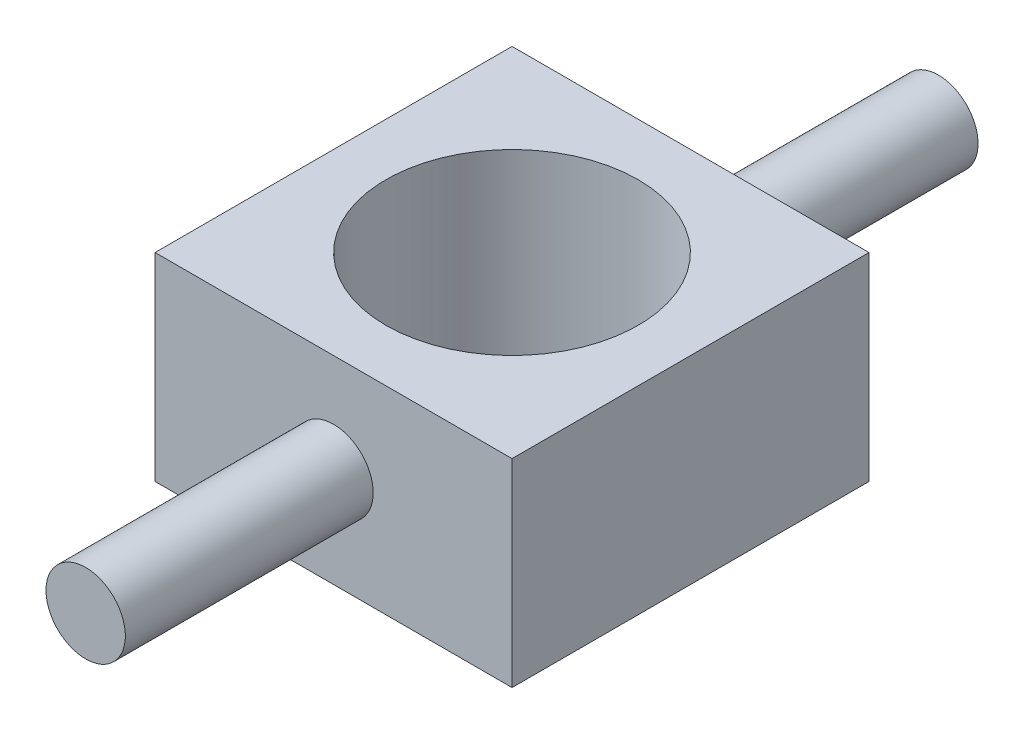
ISO-10303-21;
HEADER;
FILE_DESCRIPTION(('STEP AP214'),'2;1');
FILE_NAME('part.step','',(''),(''),'','','');
FILE_SCHEMA(('AUTOMOTIVE_DESIGN { 1 0 10303 214 1 1 1 1 }'));
ENDSEC;
DATA;
#1=APPLICATION_CONTEXT('core data for automotive mechanical design processes');
#2=APPLICATION_PROTOCOL_DEFINITION('international standard','automotive_design',2000,#1);
#3=PRODUCT_CONTEXT('',#1,'mechanical');
#4=PRODUCT('Part','Part','',(#3));
#5=PRODUCT_RELATED_PRODUCT_CATEGORY('part','',(#4));
#6=PRODUCT_DEFINITION_FORMATION('','',#4);
#7=PRODUCT_DEFINITION_CONTEXT('part definition',#1,'design');
#8=PRODUCT_DEFINITION('design','',#6,#7);
#9=PRODUCT_DEFINITION_SHAPE('','',#8);
#10=(LENGTH_UNIT() NAMED_UNIT(*) SI_UNIT(.MILLI.,.METRE.));
#11=(NAMED_UNIT(*) PLANE_ANGLE_UNIT() SI_UNIT($,.RADIAN.));
#12=(NAMED_UNIT(*) SI_UNIT($,.STERADIAN.) SOLID_ANGLE_UNIT());
#13=UNCERTAINTY_MEASURE_WITH_UNIT(LENGTH_MEASURE(1.E-05),#10,'distance_accuracy_value','');
#14=(GEOMETRIC_REPRESENTATION_CONTEXT(3) GLOBAL_UNCERTAINTY_ASSIGNED_CONTEXT((#13)) GLOBAL_UNIT_ASSIGNED_CONTEXT((#10,
#11,#12)) REPRESENTATION_CONTEXT('',''));
#15=CARTESIAN_POINT('',(0.,0.,0.));
#16=DIRECTION('',(0.,0.,1.));
#17=DIRECTION('',(1.,0.,0.));
#18=AXIS2_PLACEMENT_3D('',#15,#16,#17);
#19=CARTESIAN_POINT('',(18.,-10.,-18.));
#20=DIRECTION('',(1.,0.,0.));
#21=DIRECTION('',(0.,0.,-1.));
#22=AXIS2_PLACEMENT_3D('',#19,#20,#21);
#23=PLANE('',#22);
#24=DIRECTION('',(0.,1.,0.));
#25=VECTOR('',#24,1.);
#26=CARTESIAN_POINT('',(18.,-10.,-18.));
#27=LINE('',#26,#25);
#28=CARTESIAN_POINT('',(18.,-10.,-18.));
#29=VERTEX_POINT('',#28);
#30=CARTESIAN_POINT('',(18.,10.,-18.));
#31=VERTEX_POINT('',#30);
#32=EDGE_CURVE('E48',#29,#31,#27,.T.);
#33=ORIENTED_EDGE('',*,*,#32,.T.);
#34=DIRECTION('',(0.,0.,-1.));
#35=VECTOR('',#34,1.);
#36=CARTESIAN_POINT('',(18.,10.,-18.));
#37=LINE('',#36,#35);
#38=CARTESIAN_POINT('',(18.,10.,18.));
#39=VERTEX_POINT('',#38);
#40=EDGE_CURVE('E88',#39,#31,#37,.T.);
#41=ORIENTED_EDGE('',*,*,#40,.F.);
#42=DIRECTION('',(0.,1.,0.));
#43=VECTOR('',#42,1.);
#44=CARTESIAN_POINT('',(18.,-10.,18.));
#45=LINE('',#44,#43);
#46=CARTESIAN_POINT('',(18.,-10.,18.));
#47=VERTEX_POINT('',#46);
#48=EDGE_CURVE('E54',#47,#39,#45,.T.);
#49=ORIENTED_EDGE('',*,*,#48,.F.);
#50=DIRECTION('',(0.,0.,-1.));
#51=VECTOR('',#50,1.);
#52=CARTESIAN_POINT('',(18.,-10.,-18.));
#53=LINE('',#52,#51);
#54=EDGE_CURVE('E89',#47,#29,#53,.T.);
#55=ORIENTED_EDGE('',*,*,#54,.T.);
#56=EDGE_LOOP('',(#33,#41,#49,#55));
#57=FACE_BOUND('',#56,.T.);
#58=ADVANCED_FACE('F45',(#57),#23,.T.);
#59=CARTESIAN_POINT('',(-18.,-10.,18.));
#60=DIRECTION('',(0.,0.,1.));
#61=DIRECTION('',(1.,0.,0.));
#62=AXIS2_PLACEMENT_3D('',#59,#60,#61);
#63=PLANE('',#62);
#64=CARTESIAN_POINT('',(0.,0.,18.));
#65=DIRECTION('',(0.,0.,-1.));
#66=DIRECTION('',(-1.,0.,0.));
#67=AXIS2_PLACEMENT_3D('',#64,#65,#66);
#68=CIRCLE('',#67,4.);
#69=CARTESIAN_POINT('',(-4.,0.,18.));
#70=VERTEX_POINT('',#69);
#71=EDGE_CURVE('E166',#70,#70,#68,.T.);
#72=ORIENTED_EDGE('',*,*,#71,.T.);
#73=EDGE_LOOP('',(#72));
#74=FACE_BOUND('',#73,.T.);
#75=ORIENTED_EDGE('',*,*,#48,.T.);
#76=DIRECTION('',(1.,0.,0.));
#77=VECTOR('',#76,1.);
#78=CARTESIAN_POINT('',(-18.,10.,18.));
#79=LINE('',#78,#77);
#80=CARTESIAN_POINT('',(-18.,10.,18.));
#81=VERTEX_POINT('',#80);
#82=EDGE_CURVE('E107',#81,#39,#79,.T.);
#83=ORIENTED_EDGE('',*,*,#82,.F.);
#84=DIRECTION('',(0.,1.,0.));
#85=VECTOR('',#84,1.);
#86=CARTESIAN_POINT('',(-18.,-10.,18.));
#87=LINE('',#86,#85);
#88=CARTESIAN_POINT('',(-18.,-10.,18.));
#89=VERTEX_POINT('',#88);
#90=EDGE_CURVE('E69',#89,#81,#87,.T.);
#91=ORIENTED_EDGE('',*,*,#90,.F.);
#92=DIRECTION('',(1.,0.,0.));
#93=VECTOR('',#92,1.);
#94=CARTESIAN_POINT('',(-18.,-10.,18.));
#95=LINE('',#94,#93);
#96=EDGE_CURVE('E95',#89,#47,#95,.T.);
#97=ORIENTED_EDGE('',*,*,#96,.T.);
#98=EDGE_LOOP('',(#75,#83,#91,#97));
#99=FACE_BOUND('',#98,.T.);
#100=ADVANCED_FACE('F139',(#74,#99),#63,.T.);
#101=CARTESIAN_POINT('',(-18.,-10.,-18.));
#102=DIRECTION('',(-1.,0.,0.));
#103=DIRECTION('',(0.,0.,1.));
#104=AXIS2_PLACEMENT_3D('',#101,#102,#103);
#105=PLANE('',#104);
#106=ORIENTED_EDGE('',*,*,#90,.T.);
#107=DIRECTION('',(0.,0.,1.));
#108=VECTOR('',#107,1.);
#109=CARTESIAN_POINT('',(-18.,10.,-18.));
#110=LINE('',#109,#108);
#111=CARTESIAN_POINT('',(-18.,10.,-18.));
#112=VERTEX_POINT('',#111);
#113=EDGE_CURVE('E103',#112,#81,#110,.T.);
#114=ORIENTED_EDGE('',*,*,#113,.F.);
#115=DIRECTION('',(0.,1.,0.));
#116=VECTOR('',#115,1.);
#117=CARTESIAN_POINT('',(-18.,-10.,-18.));
#118=LINE('',#117,#116);
#119=CARTESIAN_POINT('',(-18.,-10.,-18.));
#120=VERTEX_POINT('',#119);
#121=EDGE_CURVE('E94',#120,#112,#118,.T.);
#122=ORIENTED_EDGE('',*,*,#121,.F.);
#123=DIRECTION('',(0.,0.,1.));
#124=VECTOR('',#123,1.);
#125=CARTESIAN_POINT('',(-18.,-10.,-18.));
#126=LINE('',#125,#124);
#127=EDGE_CURVE('E126',#120,#89,#126,.T.);
#128=ORIENTED_EDGE('',*,*,#127,.T.);
#129=EDGE_LOOP('',(#106,#114,#122,#128));
#130=FACE_BOUND('',#129,.T.);
#131=ADVANCED_FACE('F136',(#130),#105,.T.);
#132=CARTESIAN_POINT('',(-18.,-10.,-18.));
#133=DIRECTION('',(0.,0.,-1.));
#134=DIRECTION('',(-1.,0.,0.));
#135=AXIS2_PLACEMENT_3D('',#132,#133,#134);
#136=PLANE('',#135);
#137=CARTESIAN_POINT('',(0.,0.,-18.));
#138=DIRECTION('',(0.,0.,-1.));
#139=DIRECTION('',(-1.,0.,0.));
#140=AXIS2_PLACEMENT_3D('',#137,#138,#139);
#141=CIRCLE('',#140,4.);
#142=CARTESIAN_POINT('',(-4.,0.,-18.));
#143=VERTEX_POINT('',#142);
#144=EDGE_CURVE('E11',#143,#143,#141,.T.);
#145=ORIENTED_EDGE('',*,*,#144,.F.);
#146=EDGE_LOOP('',(#145));
#147=FACE_BOUND('',#146,.T.);
#148=ORIENTED_EDGE('',*,*,#121,.T.);
#149=DIRECTION('',(-1.,0.,0.));
#150=VECTOR('',#149,1.);
#151=CARTESIAN_POINT('',(-18.,10.,-18.));
#152=LINE('',#151,#150);
#153=EDGE_CURVE('E97',#31,#112,#152,.T.);
#154=ORIENTED_EDGE('',*,*,#153,.F.);
#155=ORIENTED_EDGE('',*,*,#32,.F.);
#156=DIRECTION('',(-1.,0.,0.));
#157=VECTOR('',#156,1.);
#158=CARTESIAN_POINT('',(-18.,-10.,-18.));
#159=LINE('',#158,#157);
#160=EDGE_CURVE('E123',#29,#120,#159,.T.);
#161=ORIENTED_EDGE('',*,*,#160,.T.);
#162=EDGE_LOOP('',(#148,#154,#155,#161));
#163=FACE_BOUND('',#162,.T.);
#164=ADVANCED_FACE('F98',(#147,#163),#136,.T.);
#165=CARTESIAN_POINT('',(0.,-10.,0.));
#166=DIRECTION('',(0.,1.,0.));
#167=DIRECTION('',(0.,0.,1.));
#168=AXIS2_PLACEMENT_3D('',#165,#166,#167);
#169=PLANE('',#168);
#170=CARTESIAN_POINT('',(0.,-10.,0.));
#171=DIRECTION('',(0.,-1.,0.));
#172=DIRECTION('',(0.,0.,-1.));
#173=AXIS2_PLACEMENT_3D('',#170,#171,#172);
#174=CIRCLE('',#173,12.725);
#175=CARTESIAN_POINT('',(0.,-10.,-12.725));
#176=VERTEX_POINT('',#175);
#177=EDGE_CURVE('E113',#176,#176,#174,.T.);
#178=ORIENTED_EDGE('',*,*,#177,.F.);
#179=EDGE_LOOP('',(#178));
#180=FACE_BOUND('',#179,.T.);
#181=ORIENTED_EDGE('',*,*,#54,.F.);
#182=ORIENTED_EDGE('',*,*,#96,.F.);
#183=ORIENTED_EDGE('',*,*,#127,.F.);
#184=ORIENTED_EDGE('',*,*,#160,.F.);
#185=EDGE_LOOP('',(#181,#182,#183,#184));
#186=FACE_BOUND('',#185,.T.);
#187=ADVANCED_FACE('F141',(#180,#186),#169,.F.);
#188=CARTESIAN_POINT('',(0.,10.,0.));
#189=DIRECTION('',(0.,1.,0.));
#190=DIRECTION('',(0.,0.,1.));
#191=AXIS2_PLACEMENT_3D('',#188,#189,#190);
#192=PLANE('',#191);
#193=CARTESIAN_POINT('',(0.,10.,0.));
#194=DIRECTION('',(0.,-1.,0.));
#195=DIRECTION('',(0.,0.,-1.));
#196=AXIS2_PLACEMENT_3D('',#193,#194,#195);
#197=CIRCLE('',#196,12.725);
#198=CARTESIAN_POINT('',(0.,10.,-12.725));
#199=VERTEX_POINT('',#198);
#200=EDGE_CURVE('E109',#199,#199,#197,.T.);
#201=ORIENTED_EDGE('',*,*,#200,.T.);
#202=EDGE_LOOP('',(#201));
#203=FACE_BOUND('',#202,.T.);
#204=ORIENTED_EDGE('',*,*,#40,.T.);
#205=ORIENTED_EDGE('',*,*,#153,.T.);
#206=ORIENTED_EDGE('',*,*,#113,.T.);
#207=ORIENTED_EDGE('',*,*,#82,.T.);
#208=EDGE_LOOP('',(#204,#205,#206,#207));
#209=FACE_BOUND('',#208,.T.);
#210=ADVANCED_FACE('F106',(#203,#209),#192,.T.);
#211=CARTESIAN_POINT('',(0.,10.,0.));
#212=DIRECTION('',(0.,-1.,0.));
#213=DIRECTION('',(0.,0.,-1.));
#214=AXIS2_PLACEMENT_3D('',#211,#212,#213);
#215=CYLINDRICAL_SURFACE('',#214,12.725);
#216=ORIENTED_EDGE('',*,*,#200,.F.);
#217=EDGE_LOOP('',(#216));
#218=FACE_BOUND('',#217,.T.);
#219=ORIENTED_EDGE('',*,*,#177,.T.);
#220=EDGE_LOOP('',(#219));
#221=FACE_BOUND('',#220,.T.);
#222=ADVANCED_FACE('F149',(#218,#221),#215,.F.);
#223=CARTESIAN_POINT('',(0.,0.,-43.));
#224=DIRECTION('',(0.,0.,1.));
#225=DIRECTION('',(1.,0.,0.));
#226=AXIS2_PLACEMENT_3D('',#223,#224,#225);
#227=CYLINDRICAL_SURFACE('',#226,4.);
#228=CARTESIAN_POINT('',(0.,0.,-43.));
#229=DIRECTION('',(0.,0.,-1.));
#230=DIRECTION('',(-1.,0.,0.));
#231=AXIS2_PLACEMENT_3D('',#228,#229,#230);
#232=CIRCLE('',#231,4.);
#233=CARTESIAN_POINT('',(-4.,0.,-43.));
#234=VERTEX_POINT('',#233);
#235=EDGE_CURVE('E173',#234,#234,#232,.T.);
#236=ORIENTED_EDGE('',*,*,#235,.F.);
#237=EDGE_LOOP('',(#236));
#238=FACE_BOUND('',#237,.T.);
#239=ORIENTED_EDGE('',*,*,#144,.T.);
#240=EDGE_LOOP('',(#239));
#241=FACE_BOUND('',#240,.T.);
#242=ADVANCED_FACE('F184',(#238,#241),#227,.T.);
#243=CARTESIAN_POINT('',(0.,0.,-43.));
#244=DIRECTION('',(0.,0.,-1.));
#245=DIRECTION('',(-1.,0.,0.));
#246=AXIS2_PLACEMENT_3D('',#243,#244,#245);
#247=PLANE('',#246);
#248=ORIENTED_EDGE('',*,*,#235,.T.);
#249=EDGE_LOOP('',(#248));
#250=FACE_BOUND('',#249,.T.);
#251=ADVANCED_FACE('F190',(#250),#247,.T.);
#252=CARTESIAN_POINT('',(0.,0.,43.));
#253=DIRECTION('',(0.,0.,-1.));
#254=DIRECTION('',(-1.,0.,0.));
#255=AXIS2_PLACEMENT_3D('',#252,#253,#254);
#256=CYLINDRICAL_SURFACE('',#255,4.);
#257=CARTESIAN_POINT('',(0.,0.,43.));
#258=DIRECTION('',(0.,0.,-1.));
#259=DIRECTION('',(-1.,0.,0.));
#260=AXIS2_PLACEMENT_3D('',#257,#258,#259);
#261=CIRCLE('',#260,4.);
#262=CARTESIAN_POINT('',(-4.,0.,43.));
#263=VERTEX_POINT('',#262);
#264=EDGE_CURVE('E169',#263,#263,#261,.T.);
#265=ORIENTED_EDGE('',*,*,#264,.T.);
#266=EDGE_LOOP('',(#265));
#267=FACE_BOUND('',#266,.T.);
#268=ORIENTED_EDGE('',*,*,#71,.F.);
#269=EDGE_LOOP('',(#268));
#270=FACE_BOUND('',#269,.T.);
#271=ADVANCED_FACE('F197',(#267,#270),#256,.T.);
#272=CARTESIAN_POINT('',(0.,0.,43.));
#273=DIRECTION('',(0.,0.,1.));
#274=DIRECTION('',(-1.,0.,0.));
#275=AXIS2_PLACEMENT_3D('',#272,#273,#274);
#276=PLANE('',#275);
#277=ORIENTED_EDGE('',*,*,#264,.F.);
#278=EDGE_LOOP('',(#277));
#279=FACE_BOUND('',#278,.T.);
#280=ADVANCED_FACE('F200',(#279),#276,.T.);
#281=CLOSED_SHELL('',(#58,#100,#131,#164,#187,#210,#222,#242,#251,#271,#280));
#282=MANIFOLD_SOLID_BREP('B2',#281);
#283=ADVANCED_BREP_SHAPE_REPRESENTATION('',(#18,#282),#14);
#284=SHAPE_DEFINITION_REPRESENTATION(#9,#283);
ENDSEC;
END-ISO-10303-21;
